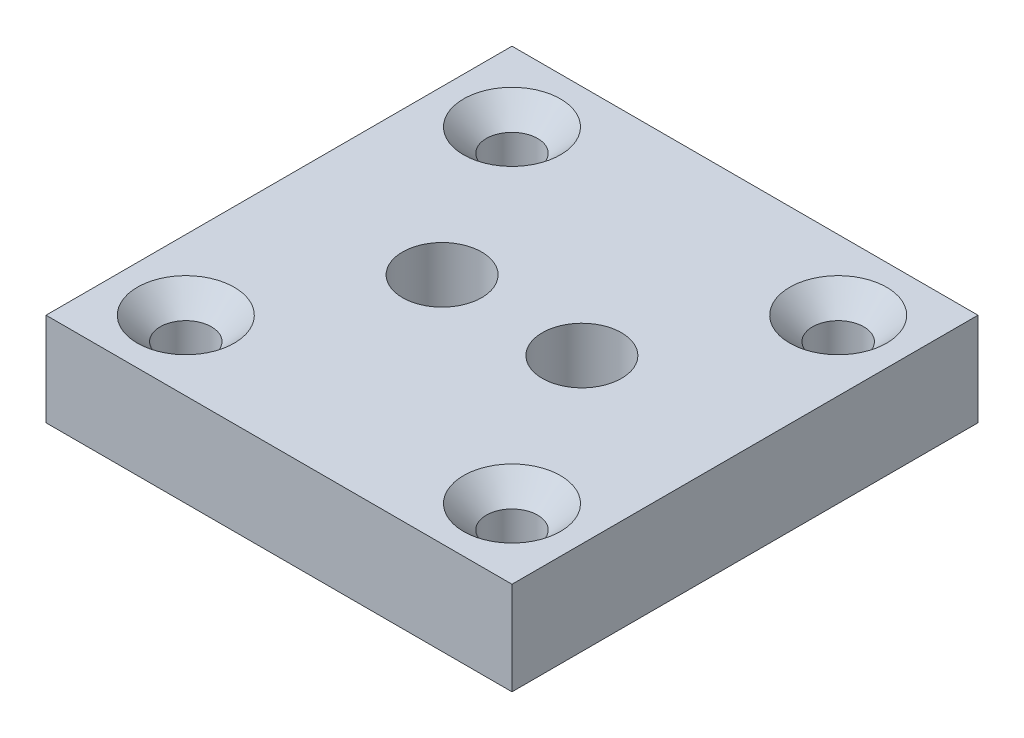
ISO-10303-21;
HEADER;
FILE_DESCRIPTION(('STEP AP214'),'2;1');
FILE_NAME('part.step','',(''),(''),'','','');
FILE_SCHEMA(('AUTOMOTIVE_DESIGN { 1 0 10303 214 1 1 1 1 }'));
ENDSEC;
DATA;
#1=APPLICATION_CONTEXT('core data for automotive mechanical design processes');
#2=APPLICATION_PROTOCOL_DEFINITION('international standard','automotive_design',2000,#1);
#3=PRODUCT_CONTEXT('',#1,'mechanical');
#4=PRODUCT('Part','Part','',(#3));
#5=PRODUCT_RELATED_PRODUCT_CATEGORY('part','',(#4));
#6=PRODUCT_DEFINITION_FORMATION('','',#4);
#7=PRODUCT_DEFINITION_CONTEXT('part definition',#1,'design');
#8=PRODUCT_DEFINITION('design','',#6,#7);
#9=PRODUCT_DEFINITION_SHAPE('','',#8);
#10=(LENGTH_UNIT() NAMED_UNIT(*) SI_UNIT(.MILLI.,.METRE.));
#11=(NAMED_UNIT(*) PLANE_ANGLE_UNIT() SI_UNIT($,.RADIAN.));
#12=(NAMED_UNIT(*) SI_UNIT($,.STERADIAN.) SOLID_ANGLE_UNIT());
#13=UNCERTAINTY_MEASURE_WITH_UNIT(LENGTH_MEASURE(1.E-05),#10,'distance_accuracy_value','');
#14=(GEOMETRIC_REPRESENTATION_CONTEXT(3) GLOBAL_UNCERTAINTY_ASSIGNED_CONTEXT((#13)) GLOBAL_UNIT_ASSIGNED_CONTEXT((#10,
#11,#12)) REPRESENTATION_CONTEXT('',''));
#15=CARTESIAN_POINT('',(0.,0.,0.));
#16=DIRECTION('',(0.,0.,1.));
#17=DIRECTION('',(1.,0.,0.));
#18=AXIS2_PLACEMENT_3D('',#15,#16,#17);
#19=CARTESIAN_POINT('',(0.,10.,50.));
#20=DIRECTION('',(0.,1.,0.));
#21=DIRECTION('',(0.,0.,1.));
#22=AXIS2_PLACEMENT_3D('',#19,#20,#21);
#23=PLANE('',#22);
#24=CARTESIAN_POINT('',(7.5,10.,7.5));
#25=DIRECTION('',(0.,1.,0.));
#26=DIRECTION('',(0.,0.,1.));
#27=AXIS2_PLACEMENT_3D('',#24,#25,#26);
#28=CIRCLE('',#27,5.2);
#29=CARTESIAN_POINT('',(7.5,10.,12.7));
#30=VERTEX_POINT('',#29);
#31=EDGE_CURVE('E177',#30,#30,#28,.T.);
#32=ORIENTED_EDGE('',*,*,#31,.F.);
#33=EDGE_LOOP('',(#32));
#34=FACE_BOUND('',#33,.T.);
#35=CARTESIAN_POINT('',(42.5,10.,7.5));
#36=DIRECTION('',(0.,1.,0.));
#37=DIRECTION('',(0.,0.,1.));
#38=AXIS2_PLACEMENT_3D('',#35,#36,#37);
#39=CIRCLE('',#38,5.2);
#40=CARTESIAN_POINT('',(42.5,10.,12.7));
#41=VERTEX_POINT('',#40);
#42=EDGE_CURVE('E184',#41,#41,#39,.T.);
#43=ORIENTED_EDGE('',*,*,#42,.F.);
#44=EDGE_LOOP('',(#43));
#45=FACE_BOUND('',#44,.T.);
#46=CARTESIAN_POINT('',(42.5,10.,42.5));
#47=DIRECTION('',(0.,1.,0.));
#48=DIRECTION('',(0.,0.,1.));
#49=AXIS2_PLACEMENT_3D('',#46,#47,#48);
#50=CIRCLE('',#49,5.2);
#51=CARTESIAN_POINT('',(42.5,10.,47.7));
#52=VERTEX_POINT('',#51);
#53=EDGE_CURVE('E193',#52,#52,#50,.T.);
#54=ORIENTED_EDGE('',*,*,#53,.F.);
#55=EDGE_LOOP('',(#54));
#56=FACE_BOUND('',#55,.T.);
#57=CARTESIAN_POINT('',(7.50000000000001,10.,42.5));
#58=DIRECTION('',(0.,1.,0.));
#59=DIRECTION('',(0.,0.,1.));
#60=AXIS2_PLACEMENT_3D('',#57,#58,#59);
#61=CIRCLE('',#60,5.2);
#62=CARTESIAN_POINT('',(7.50000000000001,10.,47.7));
#63=VERTEX_POINT('',#62);
#64=EDGE_CURVE('E202',#63,#63,#61,.T.);
#65=ORIENTED_EDGE('',*,*,#64,.F.);
#66=EDGE_LOOP('',(#65));
#67=FACE_BOUND('',#66,.T.);
#68=CARTESIAN_POINT('',(17.5,10.,25.));
#69=DIRECTION('',(0.,1.,0.));
#70=DIRECTION('',(0.,0.,1.));
#71=AXIS2_PLACEMENT_3D('',#68,#69,#70);
#72=CIRCLE('',#71,4.25);
#73=CARTESIAN_POINT('',(17.5,10.,29.25));
#74=VERTEX_POINT('',#73);
#75=EDGE_CURVE('E211',#74,#74,#72,.T.);
#76=ORIENTED_EDGE('',*,*,#75,.F.);
#77=EDGE_LOOP('',(#76));
#78=FACE_BOUND('',#77,.T.);
#79=CARTESIAN_POINT('',(32.5,10.,25.));
#80=DIRECTION('',(0.,1.,0.));
#81=DIRECTION('',(0.,0.,1.));
#82=AXIS2_PLACEMENT_3D('',#79,#80,#81);
#83=CIRCLE('',#82,4.25);
#84=CARTESIAN_POINT('',(32.5,10.,29.25));
#85=VERTEX_POINT('',#84);
#86=EDGE_CURVE('E217',#85,#85,#83,.T.);
#87=ORIENTED_EDGE('',*,*,#86,.F.);
#88=EDGE_LOOP('',(#87));
#89=FACE_BOUND('',#88,.T.);
#90=DIRECTION('',(1.,0.,0.));
#91=VECTOR('',#90,1.);
#92=CARTESIAN_POINT('',(0.,10.,0.));
#93=LINE('',#92,#91);
#94=CARTESIAN_POINT('',(0.,10.,0.));
#95=VERTEX_POINT('',#94);
#96=CARTESIAN_POINT('',(50.,10.,0.));
#97=VERTEX_POINT('',#96);
#98=EDGE_CURVE('E99',#95,#97,#93,.T.);
#99=ORIENTED_EDGE('',*,*,#98,.F.);
#100=DIRECTION('',(0.,0.,-1.));
#101=VECTOR('',#100,1.);
#102=CARTESIAN_POINT('',(0.,10.,50.));
#103=LINE('',#102,#101);
#104=CARTESIAN_POINT('',(0.,10.,50.));
#105=VERTEX_POINT('',#104);
#106=EDGE_CURVE('E11',#105,#95,#103,.T.);
#107=ORIENTED_EDGE('',*,*,#106,.F.);
#108=DIRECTION('',(1.,0.,0.));
#109=VECTOR('',#108,1.);
#110=CARTESIAN_POINT('',(0.,10.,50.));
#111=LINE('',#110,#109);
#112=CARTESIAN_POINT('',(50.,10.,50.));
#113=VERTEX_POINT('',#112);
#114=EDGE_CURVE('E92',#105,#113,#111,.T.);
#115=ORIENTED_EDGE('',*,*,#114,.T.);
#116=DIRECTION('',(0.,0.,-1.));
#117=VECTOR('',#116,1.);
#118=CARTESIAN_POINT('',(50.,10.,50.));
#119=LINE('',#118,#117);
#120=EDGE_CURVE('E37',#113,#97,#119,.T.);
#121=ORIENTED_EDGE('',*,*,#120,.T.);
#122=EDGE_LOOP('',(#99,#107,#115,#121));
#123=FACE_BOUND('',#122,.T.);
#124=ADVANCED_FACE('F34',(#34,#45,#56,#67,#78,#89,#123),#23,.T.);
#125=CARTESIAN_POINT('',(0.,0.,50.));
#126=DIRECTION('',(-1.,0.,0.));
#127=DIRECTION('',(0.,-1.,0.));
#128=AXIS2_PLACEMENT_3D('',#125,#126,#127);
#129=PLANE('',#128);
#130=DIRECTION('',(0.,1.,0.));
#131=VECTOR('',#130,1.);
#132=CARTESIAN_POINT('',(0.,0.,0.));
#133=LINE('',#132,#131);
#134=CARTESIAN_POINT('',(0.,0.,0.));
#135=VERTEX_POINT('',#134);
#136=EDGE_CURVE('E94',#135,#95,#133,.T.);
#137=ORIENTED_EDGE('',*,*,#136,.F.);
#138=DIRECTION('',(0.,0.,-1.));
#139=VECTOR('',#138,1.);
#140=CARTESIAN_POINT('',(0.,0.,50.));
#141=LINE('',#140,#139);
#142=CARTESIAN_POINT('',(0.,0.,50.));
#143=VERTEX_POINT('',#142);
#144=EDGE_CURVE('E43',#143,#135,#141,.T.);
#145=ORIENTED_EDGE('',*,*,#144,.F.);
#146=DIRECTION('',(0.,1.,0.));
#147=VECTOR('',#146,1.);
#148=CARTESIAN_POINT('',(0.,0.,50.));
#149=LINE('',#148,#147);
#150=EDGE_CURVE('E82',#143,#105,#149,.T.);
#151=ORIENTED_EDGE('',*,*,#150,.T.);
#152=ORIENTED_EDGE('',*,*,#106,.T.);
#153=EDGE_LOOP('',(#137,#145,#151,#152));
#154=FACE_BOUND('',#153,.T.);
#155=ADVANCED_FACE('F110',(#154),#129,.T.);
#156=CARTESIAN_POINT('',(0.,0.,50.));
#157=DIRECTION('',(0.,1.,0.));
#158=DIRECTION('',(0.,0.,1.));
#159=AXIS2_PLACEMENT_3D('',#156,#157,#158);
#160=PLANE('',#159);
#161=CARTESIAN_POINT('',(7.5,0.,7.5));
#162=DIRECTION('',(0.,1.,0.));
#163=DIRECTION('',(0.,0.,1.));
#164=AXIS2_PLACEMENT_3D('',#161,#162,#163);
#165=CIRCLE('',#164,2.75);
#166=CARTESIAN_POINT('',(7.5,0.,10.25));
#167=VERTEX_POINT('',#166);
#168=EDGE_CURVE('E179',#167,#167,#165,.T.);
#169=ORIENTED_EDGE('',*,*,#168,.T.);
#170=EDGE_LOOP('',(#169));
#171=FACE_BOUND('',#170,.T.);
#172=CARTESIAN_POINT('',(42.5,0.,7.5));
#173=DIRECTION('',(0.,1.,0.));
#174=DIRECTION('',(0.,0.,1.));
#175=AXIS2_PLACEMENT_3D('',#172,#173,#174);
#176=CIRCLE('',#175,2.75);
#177=CARTESIAN_POINT('',(42.5,0.,10.25));
#178=VERTEX_POINT('',#177);
#179=EDGE_CURVE('E190',#178,#178,#176,.T.);
#180=ORIENTED_EDGE('',*,*,#179,.T.);
#181=EDGE_LOOP('',(#180));
#182=FACE_BOUND('',#181,.T.);
#183=CARTESIAN_POINT('',(42.5,0.,42.5));
#184=DIRECTION('',(0.,1.,0.));
#185=DIRECTION('',(0.,0.,1.));
#186=AXIS2_PLACEMENT_3D('',#183,#184,#185);
#187=CIRCLE('',#186,2.75);
#188=CARTESIAN_POINT('',(42.5,0.,45.25));
#189=VERTEX_POINT('',#188);
#190=EDGE_CURVE('E199',#189,#189,#187,.T.);
#191=ORIENTED_EDGE('',*,*,#190,.T.);
#192=EDGE_LOOP('',(#191));
#193=FACE_BOUND('',#192,.T.);
#194=CARTESIAN_POINT('',(7.50000000000001,0.,42.5));
#195=DIRECTION('',(0.,1.,0.));
#196=DIRECTION('',(0.,0.,1.));
#197=AXIS2_PLACEMENT_3D('',#194,#195,#196);
#198=CIRCLE('',#197,2.75);
#199=CARTESIAN_POINT('',(7.50000000000001,0.,45.25));
#200=VERTEX_POINT('',#199);
#201=EDGE_CURVE('E208',#200,#200,#198,.T.);
#202=ORIENTED_EDGE('',*,*,#201,.T.);
#203=EDGE_LOOP('',(#202));
#204=FACE_BOUND('',#203,.T.);
#205=CARTESIAN_POINT('',(17.5,0.,25.));
#206=DIRECTION('',(0.,1.,0.));
#207=DIRECTION('',(0.,0.,1.));
#208=AXIS2_PLACEMENT_3D('',#205,#206,#207);
#209=CIRCLE('',#208,4.25);
#210=CARTESIAN_POINT('',(17.5,0.,29.25));
#211=VERTEX_POINT('',#210);
#212=EDGE_CURVE('E214',#211,#211,#209,.T.);
#213=ORIENTED_EDGE('',*,*,#212,.T.);
#214=EDGE_LOOP('',(#213));
#215=FACE_BOUND('',#214,.T.);
#216=CARTESIAN_POINT('',(32.5,0.,25.));
#217=DIRECTION('',(0.,1.,0.));
#218=DIRECTION('',(0.,0.,1.));
#219=AXIS2_PLACEMENT_3D('',#216,#217,#218);
#220=CIRCLE('',#219,4.25);
#221=CARTESIAN_POINT('',(32.5,0.,29.25));
#222=VERTEX_POINT('',#221);
#223=EDGE_CURVE('E103',#222,#222,#220,.T.);
#224=ORIENTED_EDGE('',*,*,#223,.T.);
#225=EDGE_LOOP('',(#224));
#226=FACE_BOUND('',#225,.T.);
#227=DIRECTION('',(1.,0.,0.));
#228=VECTOR('',#227,1.);
#229=CARTESIAN_POINT('',(0.,0.,0.));
#230=LINE('',#229,#228);
#231=CARTESIAN_POINT('',(50.,0.,0.));
#232=VERTEX_POINT('',#231);
#233=EDGE_CURVE('E87',#135,#232,#230,.T.);
#234=ORIENTED_EDGE('',*,*,#233,.T.);
#235=DIRECTION('',(0.,0.,-1.));
#236=VECTOR('',#235,1.);
#237=CARTESIAN_POINT('',(50.,0.,50.));
#238=LINE('',#237,#236);
#239=CARTESIAN_POINT('',(50.,0.,50.));
#240=VERTEX_POINT('',#239);
#241=EDGE_CURVE('E85',#240,#232,#238,.T.);
#242=ORIENTED_EDGE('',*,*,#241,.F.);
#243=DIRECTION('',(1.,0.,0.));
#244=VECTOR('',#243,1.);
#245=CARTESIAN_POINT('',(0.,0.,50.));
#246=LINE('',#245,#244);
#247=EDGE_CURVE('E79',#143,#240,#246,.T.);
#248=ORIENTED_EDGE('',*,*,#247,.F.);
#249=ORIENTED_EDGE('',*,*,#144,.T.);
#250=EDGE_LOOP('',(#234,#242,#248,#249));
#251=FACE_BOUND('',#250,.T.);
#252=ADVANCED_FACE('F86',(#171,#182,#193,#204,#215,#226,#251),#160,.F.);
#253=CARTESIAN_POINT('',(50.,0.,50.));
#254=DIRECTION('',(-1.,0.,0.));
#255=DIRECTION('',(0.,0.,1.));
#256=AXIS2_PLACEMENT_3D('',#253,#254,#255);
#257=PLANE('',#256);
#258=DIRECTION('',(0.,1.,0.));
#259=VECTOR('',#258,1.);
#260=CARTESIAN_POINT('',(50.,0.,0.));
#261=LINE('',#260,#259);
#262=EDGE_CURVE('E102',#232,#97,#261,.T.);
#263=ORIENTED_EDGE('',*,*,#262,.T.);
#264=ORIENTED_EDGE('',*,*,#120,.F.);
#265=DIRECTION('',(0.,1.,0.));
#266=VECTOR('',#265,1.);
#267=CARTESIAN_POINT('',(50.,0.,50.));
#268=LINE('',#267,#266);
#269=EDGE_CURVE('E76',#240,#113,#268,.T.);
#270=ORIENTED_EDGE('',*,*,#269,.F.);
#271=ORIENTED_EDGE('',*,*,#241,.T.);
#272=EDGE_LOOP('',(#263,#264,#270,#271));
#273=FACE_BOUND('',#272,.T.);
#274=ADVANCED_FACE('F91',(#273),#257,.F.);
#275=CARTESIAN_POINT('',(0.,0.,50.));
#276=DIRECTION('',(0.,0.,1.));
#277=DIRECTION('',(1.,0.,0.));
#278=AXIS2_PLACEMENT_3D('',#275,#276,#277);
#279=PLANE('',#278);
#280=ORIENTED_EDGE('',*,*,#114,.F.);
#281=ORIENTED_EDGE('',*,*,#150,.F.);
#282=ORIENTED_EDGE('',*,*,#247,.T.);
#283=ORIENTED_EDGE('',*,*,#269,.T.);
#284=EDGE_LOOP('',(#280,#281,#282,#283));
#285=FACE_BOUND('',#284,.T.);
#286=ADVANCED_FACE('F81',(#285),#279,.T.);
#287=CARTESIAN_POINT('',(0.,0.,0.));
#288=DIRECTION('',(0.,0.,1.));
#289=DIRECTION('',(1.,0.,0.));
#290=AXIS2_PLACEMENT_3D('',#287,#288,#289);
#291=PLANE('',#290);
#292=ORIENTED_EDGE('',*,*,#98,.T.);
#293=ORIENTED_EDGE('',*,*,#262,.F.);
#294=ORIENTED_EDGE('',*,*,#233,.F.);
#295=ORIENTED_EDGE('',*,*,#136,.T.);
#296=EDGE_LOOP('',(#292,#293,#294,#295));
#297=FACE_BOUND('',#296,.T.);
#298=ADVANCED_FACE('F109',(#297),#291,.F.);
#299=CARTESIAN_POINT('',(32.5,10.,25.));
#300=DIRECTION('',(0.,1.,0.));
#301=DIRECTION('',(0.,0.,1.));
#302=AXIS2_PLACEMENT_3D('',#299,#300,#301);
#303=CYLINDRICAL_SURFACE('',#302,4.25);
#304=ORIENTED_EDGE('',*,*,#223,.F.);
#305=EDGE_LOOP('',(#304));
#306=FACE_BOUND('',#305,.T.);
#307=ORIENTED_EDGE('',*,*,#86,.T.);
#308=EDGE_LOOP('',(#307));
#309=FACE_BOUND('',#308,.T.);
#310=ADVANCED_FACE('F129',(#306,#309),#303,.F.);
#311=CARTESIAN_POINT('',(17.5,10.,25.));
#312=DIRECTION('',(0.,1.,0.));
#313=DIRECTION('',(0.,0.,1.));
#314=AXIS2_PLACEMENT_3D('',#311,#312,#313);
#315=CYLINDRICAL_SURFACE('',#314,4.25);
#316=ORIENTED_EDGE('',*,*,#212,.F.);
#317=EDGE_LOOP('',(#316));
#318=FACE_BOUND('',#317,.T.);
#319=ORIENTED_EDGE('',*,*,#75,.T.);
#320=EDGE_LOOP('',(#319));
#321=FACE_BOUND('',#320,.T.);
#322=ADVANCED_FACE('F133',(#318,#321),#315,.F.);
#323=CARTESIAN_POINT('',(7.50000000000001,10.,42.5));
#324=DIRECTION('',(0.,1.,0.));
#325=DIRECTION('',(0.,0.,1.));
#326=AXIS2_PLACEMENT_3D('',#323,#324,#325);
#327=CYLINDRICAL_SURFACE('',#326,2.74999999999999);
#328=ORIENTED_EDGE('',*,*,#201,.F.);
#329=EDGE_LOOP('',(#328));
#330=FACE_BOUND('',#329,.T.);
#331=CARTESIAN_POINT('',(7.50000000000001,7.54999999999999,42.5));
#332=DIRECTION('',(0.,1.,0.));
#333=DIRECTION('',(0.,0.,1.));
#334=AXIS2_PLACEMENT_3D('',#331,#332,#333);
#335=CIRCLE('',#334,2.74999999999999);
#336=CARTESIAN_POINT('',(7.50000000000001,7.54999999999999,45.25));
#337=VERTEX_POINT('',#336);
#338=EDGE_CURVE('E205',#337,#337,#335,.T.);
#339=ORIENTED_EDGE('',*,*,#338,.T.);
#340=EDGE_LOOP('',(#339));
#341=FACE_BOUND('',#340,.T.);
#342=ADVANCED_FACE('F137',(#330,#341),#327,.F.);
#343=CARTESIAN_POINT('',(7.50000000000001,10.,42.5));
#344=DIRECTION('',(0.,1.,0.));
#345=DIRECTION('',(0.,0.,1.));
#346=AXIS2_PLACEMENT_3D('',#343,#344,#345);
#347=CONICAL_SURFACE('',#346,5.2,0.785398163397449);
#348=ORIENTED_EDGE('',*,*,#338,.F.);
#349=EDGE_LOOP('',(#348));
#350=FACE_BOUND('',#349,.T.);
#351=ORIENTED_EDGE('',*,*,#64,.T.);
#352=EDGE_LOOP('',(#351));
#353=FACE_BOUND('',#352,.T.);
#354=ADVANCED_FACE('F141',(#350,#353),#347,.F.);
#355=CARTESIAN_POINT('',(42.5,10.,42.5));
#356=DIRECTION('',(0.,1.,0.));
#357=DIRECTION('',(0.,0.,1.));
#358=AXIS2_PLACEMENT_3D('',#355,#356,#357);
#359=CYLINDRICAL_SURFACE('',#358,2.74999999999999);
#360=ORIENTED_EDGE('',*,*,#190,.F.);
#361=EDGE_LOOP('',(#360));
#362=FACE_BOUND('',#361,.T.);
#363=CARTESIAN_POINT('',(42.5,7.54999999999999,42.5));
#364=DIRECTION('',(0.,1.,0.));
#365=DIRECTION('',(0.,0.,1.));
#366=AXIS2_PLACEMENT_3D('',#363,#364,#365);
#367=CIRCLE('',#366,2.74999999999999);
#368=CARTESIAN_POINT('',(42.5,7.54999999999999,45.25));
#369=VERTEX_POINT('',#368);
#370=EDGE_CURVE('E196',#369,#369,#367,.T.);
#371=ORIENTED_EDGE('',*,*,#370,.T.);
#372=EDGE_LOOP('',(#371));
#373=FACE_BOUND('',#372,.T.);
#374=ADVANCED_FACE('F145',(#362,#373),#359,.F.);
#375=CARTESIAN_POINT('',(42.5,10.,42.5));
#376=DIRECTION('',(0.,1.,0.));
#377=DIRECTION('',(0.,0.,1.));
#378=AXIS2_PLACEMENT_3D('',#375,#376,#377);
#379=CONICAL_SURFACE('',#378,5.2,0.785398163397448);
#380=ORIENTED_EDGE('',*,*,#370,.F.);
#381=EDGE_LOOP('',(#380));
#382=FACE_BOUND('',#381,.T.);
#383=ORIENTED_EDGE('',*,*,#53,.T.);
#384=EDGE_LOOP('',(#383));
#385=FACE_BOUND('',#384,.T.);
#386=ADVANCED_FACE('F149',(#382,#385),#379,.F.);
#387=CARTESIAN_POINT('',(42.5,10.,7.5));
#388=DIRECTION('',(0.,1.,0.));
#389=DIRECTION('',(0.,0.,1.));
#390=AXIS2_PLACEMENT_3D('',#387,#388,#389);
#391=CYLINDRICAL_SURFACE('',#390,2.74999999999999);
#392=ORIENTED_EDGE('',*,*,#179,.F.);
#393=EDGE_LOOP('',(#392));
#394=FACE_BOUND('',#393,.T.);
#395=CARTESIAN_POINT('',(42.5,7.54999999999999,7.5));
#396=DIRECTION('',(0.,1.,0.));
#397=DIRECTION('',(0.,0.,1.));
#398=AXIS2_PLACEMENT_3D('',#395,#396,#397);
#399=CIRCLE('',#398,2.74999999999999);
#400=CARTESIAN_POINT('',(42.5,7.54999999999999,10.25));
#401=VERTEX_POINT('',#400);
#402=EDGE_CURVE('E187',#401,#401,#399,.T.);
#403=ORIENTED_EDGE('',*,*,#402,.T.);
#404=EDGE_LOOP('',(#403));
#405=FACE_BOUND('',#404,.T.);
#406=ADVANCED_FACE('F153',(#394,#405),#391,.F.);
#407=CARTESIAN_POINT('',(42.5,10.,7.5));
#408=DIRECTION('',(0.,1.,0.));
#409=DIRECTION('',(0.,0.,1.));
#410=AXIS2_PLACEMENT_3D('',#407,#408,#409);
#411=CONICAL_SURFACE('',#410,5.2,0.785398163397449);
#412=ORIENTED_EDGE('',*,*,#402,.F.);
#413=EDGE_LOOP('',(#412));
#414=FACE_BOUND('',#413,.T.);
#415=ORIENTED_EDGE('',*,*,#42,.T.);
#416=EDGE_LOOP('',(#415));
#417=FACE_BOUND('',#416,.T.);
#418=ADVANCED_FACE('F157',(#414,#417),#411,.F.);
#419=CARTESIAN_POINT('',(7.5,10.,7.5));
#420=DIRECTION('',(0.,1.,0.));
#421=DIRECTION('',(0.,0.,1.));
#422=AXIS2_PLACEMENT_3D('',#419,#420,#421);
#423=CYLINDRICAL_SURFACE('',#422,2.74999999999999);
#424=ORIENTED_EDGE('',*,*,#168,.F.);
#425=EDGE_LOOP('',(#424));
#426=FACE_BOUND('',#425,.T.);
#427=CARTESIAN_POINT('',(7.5,7.54999999999999,7.5));
#428=DIRECTION('',(0.,1.,0.));
#429=DIRECTION('',(0.,0.,1.));
#430=AXIS2_PLACEMENT_3D('',#427,#428,#429);
#431=CIRCLE('',#430,2.74999999999999);
#432=CARTESIAN_POINT('',(7.5,7.54999999999999,10.25));
#433=VERTEX_POINT('',#432);
#434=EDGE_CURVE('E174',#433,#433,#431,.T.);
#435=ORIENTED_EDGE('',*,*,#434,.T.);
#436=EDGE_LOOP('',(#435));
#437=FACE_BOUND('',#436,.T.);
#438=ADVANCED_FACE('F161',(#426,#437),#423,.F.);
#439=CARTESIAN_POINT('',(7.5,10.,7.5));
#440=DIRECTION('',(0.,1.,0.));
#441=DIRECTION('',(0.,0.,1.));
#442=AXIS2_PLACEMENT_3D('',#439,#440,#441);
#443=CONICAL_SURFACE('',#442,5.2,0.785398163397449);
#444=ORIENTED_EDGE('',*,*,#434,.F.);
#445=EDGE_LOOP('',(#444));
#446=FACE_BOUND('',#445,.T.);
#447=ORIENTED_EDGE('',*,*,#31,.T.);
#448=EDGE_LOOP('',(#447));
#449=FACE_BOUND('',#448,.T.);
#450=ADVANCED_FACE('F165',(#446,#449),#443,.F.);
#451=CLOSED_SHELL('',(#124,#155,#252,#274,#286,#298,#310,#322,#342,#354,#374,#386,#406,#418,
#438,#450));
#452=MANIFOLD_SOLID_BREP('B2',#451);
#453=ADVANCED_BREP_SHAPE_REPRESENTATION('',(#18,#452),#14);
#454=SHAPE_DEFINITION_REPRESENTATION(#9,#453);
ENDSEC;
END-ISO-10303-21;
